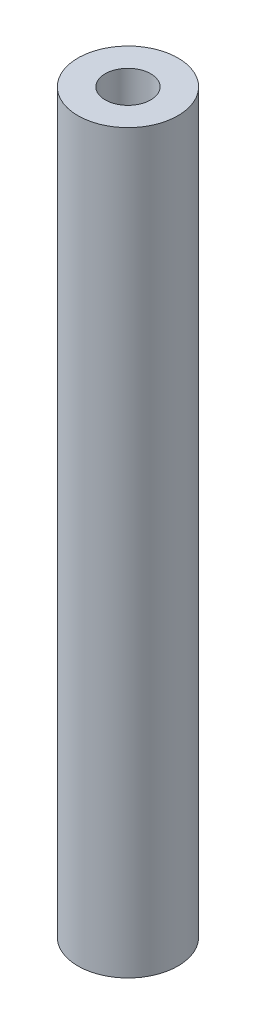
ISO-10303-21;
HEADER;
FILE_DESCRIPTION(('STEP AP214'),'2;1');
FILE_NAME('part.step','',(''),(''),'','','');
FILE_SCHEMA(('AUTOMOTIVE_DESIGN { 1 0 10303 214 1 1 1 1 }'));
ENDSEC;
DATA;
#1=APPLICATION_CONTEXT('core data for automotive mechanical design processes');
#2=APPLICATION_PROTOCOL_DEFINITION('international standard','automotive_design',2000,#1);
#3=PRODUCT_CONTEXT('',#1,'mechanical');
#4=PRODUCT('Part','Part','',(#3));
#5=PRODUCT_RELATED_PRODUCT_CATEGORY('part','',(#4));
#6=PRODUCT_DEFINITION_FORMATION('','',#4);
#7=PRODUCT_DEFINITION_CONTEXT('part definition',#1,'design');
#8=PRODUCT_DEFINITION('design','',#6,#7);
#9=PRODUCT_DEFINITION_SHAPE('','',#8);
#10=(LENGTH_UNIT() NAMED_UNIT(*) SI_UNIT(.MILLI.,.METRE.));
#11=(NAMED_UNIT(*) PLANE_ANGLE_UNIT() SI_UNIT($,.RADIAN.));
#12=(NAMED_UNIT(*) SI_UNIT($,.STERADIAN.) SOLID_ANGLE_UNIT());
#13=UNCERTAINTY_MEASURE_WITH_UNIT(LENGTH_MEASURE(1.E-05),#10,'distance_accuracy_value','');
#14=(GEOMETRIC_REPRESENTATION_CONTEXT(3) GLOBAL_UNCERTAINTY_ASSIGNED_CONTEXT((#13)) GLOBAL_UNIT_ASSIGNED_CONTEXT((#10,
#11,#12)) REPRESENTATION_CONTEXT('',''));
#15=CARTESIAN_POINT('',(0.,0.,0.));
#16=DIRECTION('',(0.,0.,1.));
#17=DIRECTION('',(1.,0.,0.));
#18=AXIS2_PLACEMENT_3D('',#15,#16,#17);
#19=CARTESIAN_POINT('',(0.,81.,0.));
#20=DIRECTION('',(0.,1.,0.));
#21=DIRECTION('',(0.,0.,1.));
#22=AXIS2_PLACEMENT_3D('',#19,#20,#21);
#23=PLANE('',#22);
#24=CARTESIAN_POINT('',(0.,81.,0.));
#25=DIRECTION('',(0.,1.,0.));
#26=DIRECTION('',(0.,0.,1.));
#27=AXIS2_PLACEMENT_3D('',#24,#25,#26);
#28=CIRCLE('',#27,5.5);
#29=CARTESIAN_POINT('',(0.,81.,5.5));
#30=VERTEX_POINT('',#29);
#31=EDGE_CURVE('E10',#30,#30,#28,.T.);
#32=ORIENTED_EDGE('',*,*,#31,.T.);
#33=EDGE_LOOP('',(#32));
#34=FACE_BOUND('',#33,.T.);
#35=CARTESIAN_POINT('',(0.,81.,0.));
#36=DIRECTION('',(0.,1.,0.));
#37=DIRECTION('',(0.,0.,1.));
#38=AXIS2_PLACEMENT_3D('',#35,#36,#37);
#39=CIRCLE('',#38,2.5);
#40=CARTESIAN_POINT('',(0.,81.,2.5));
#41=VERTEX_POINT('',#40);
#42=EDGE_CURVE('E49',#41,#41,#39,.T.);
#43=ORIENTED_EDGE('',*,*,#42,.F.);
#44=EDGE_LOOP('',(#43));
#45=FACE_BOUND('',#44,.T.);
#46=ADVANCED_FACE('F38',(#34,#45),#23,.T.);
#47=CARTESIAN_POINT('',(0.,0.,0.));
#48=DIRECTION('',(0.,1.,0.));
#49=DIRECTION('',(0.,0.,1.));
#50=AXIS2_PLACEMENT_3D('',#47,#48,#49);
#51=PLANE('',#50);
#52=CARTESIAN_POINT('',(0.,0.,0.));
#53=DIRECTION('',(0.,1.,0.));
#54=DIRECTION('',(0.,0.,1.));
#55=AXIS2_PLACEMENT_3D('',#52,#53,#54);
#56=CIRCLE('',#55,5.5);
#57=CARTESIAN_POINT('',(0.,0.,5.5));
#58=VERTEX_POINT('',#57);
#59=EDGE_CURVE('E42',#58,#58,#56,.T.);
#60=ORIENTED_EDGE('',*,*,#59,.F.);
#61=EDGE_LOOP('',(#60));
#62=FACE_BOUND('',#61,.T.);
#63=CARTESIAN_POINT('',(0.,0.,0.));
#64=DIRECTION('',(0.,1.,0.));
#65=DIRECTION('',(0.,0.,1.));
#66=AXIS2_PLACEMENT_3D('',#63,#64,#65);
#67=CIRCLE('',#66,2.5);
#68=CARTESIAN_POINT('',(0.,0.,2.5));
#69=VERTEX_POINT('',#68);
#70=EDGE_CURVE('E51',#69,#69,#67,.T.);
#71=ORIENTED_EDGE('',*,*,#70,.T.);
#72=EDGE_LOOP('',(#71));
#73=FACE_BOUND('',#72,.T.);
#74=ADVANCED_FACE('F61',(#62,#73),#51,.F.);
#75=CARTESIAN_POINT('',(0.,81.,0.));
#76=DIRECTION('',(0.,-1.,0.));
#77=DIRECTION('',(0.,0.,-1.));
#78=AXIS2_PLACEMENT_3D('',#75,#76,#77);
#79=CYLINDRICAL_SURFACE('',#78,5.5);
#80=ORIENTED_EDGE('',*,*,#31,.F.);
#81=EDGE_LOOP('',(#80));
#82=FACE_BOUND('',#81,.T.);
#83=ORIENTED_EDGE('',*,*,#59,.T.);
#84=EDGE_LOOP('',(#83));
#85=FACE_BOUND('',#84,.T.);
#86=ADVANCED_FACE('F40',(#82,#85),#79,.T.);
#87=CARTESIAN_POINT('',(0.,81.,0.));
#88=DIRECTION('',(0.,-1.,0.));
#89=DIRECTION('',(0.,0.,-1.));
#90=AXIS2_PLACEMENT_3D('',#87,#88,#89);
#91=CYLINDRICAL_SURFACE('',#90,2.5);
#92=ORIENTED_EDGE('',*,*,#42,.T.);
#93=EDGE_LOOP('',(#92));
#94=FACE_BOUND('',#93,.T.);
#95=ORIENTED_EDGE('',*,*,#70,.F.);
#96=EDGE_LOOP('',(#95));
#97=FACE_BOUND('',#96,.T.);
#98=ADVANCED_FACE('F57',(#94,#97),#91,.F.);
#99=CLOSED_SHELL('',(#46,#74,#86,#98));
#100=MANIFOLD_SOLID_BREP('B2',#99);
#101=ADVANCED_BREP_SHAPE_REPRESENTATION('',(#18,#100),#14);
#102=SHAPE_DEFINITION_REPRESENTATION(#9,#101);
ENDSEC;
END-ISO-10303-21;
